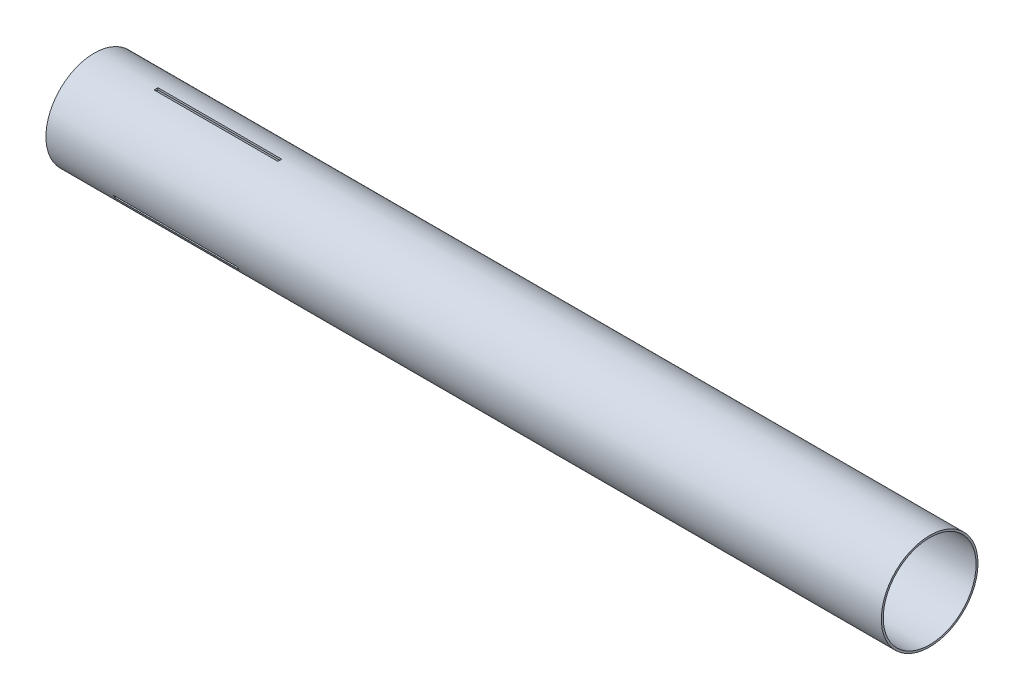
ISO-10303-21;
HEADER;
FILE_DESCRIPTION(('STEP AP214'),'2;1');
FILE_NAME('part.step','',(''),(''),'','','');
FILE_SCHEMA(('AUTOMOTIVE_DESIGN { 1 0 10303 214 1 1 1 1 }'));
ENDSEC;
DATA;
#1=APPLICATION_CONTEXT('core data for automotive mechanical design processes');
#2=APPLICATION_PROTOCOL_DEFINITION('international standard','automotive_design',2000,#1);
#3=PRODUCT_CONTEXT('',#1,'mechanical');
#4=PRODUCT('Part','Part','',(#3));
#5=PRODUCT_RELATED_PRODUCT_CATEGORY('part','',(#4));
#6=PRODUCT_DEFINITION_FORMATION('','',#4);
#7=PRODUCT_DEFINITION_CONTEXT('part definition',#1,'design');
#8=PRODUCT_DEFINITION('design','',#6,#7);
#9=PRODUCT_DEFINITION_SHAPE('','',#8);
#10=(LENGTH_UNIT() NAMED_UNIT(*) SI_UNIT(.MILLI.,.METRE.));
#11=(NAMED_UNIT(*) PLANE_ANGLE_UNIT() SI_UNIT($,.RADIAN.));
#12=(NAMED_UNIT(*) SI_UNIT($,.STERADIAN.) SOLID_ANGLE_UNIT());
#13=UNCERTAINTY_MEASURE_WITH_UNIT(LENGTH_MEASURE(1.E-05),#10,'distance_accuracy_value','');
#14=(GEOMETRIC_REPRESENTATION_CONTEXT(3) GLOBAL_UNCERTAINTY_ASSIGNED_CONTEXT((#13)) GLOBAL_UNIT_ASSIGNED_CONTEXT((#10,
#11,#12)) REPRESENTATION_CONTEXT('',''));
#15=CARTESIAN_POINT('',(0.,0.,0.));
#16=DIRECTION('',(0.,0.,1.));
#17=DIRECTION('',(1.,0.,0.));
#18=AXIS2_PLACEMENT_3D('',#15,#16,#17);
#19=CARTESIAN_POINT('',(685.8,0.,0.));
#20=DIRECTION('',(-1.,0.,0.));
#21=DIRECTION('',(0.,0.,1.));
#22=AXIS2_PLACEMENT_3D('',#19,#20,#21);
#23=CYLINDRICAL_SURFACE('',#22,39.6748);
#24=CARTESIAN_POINT('',(152.4,0.,0.));
#25=DIRECTION('',(-1.,0.,0.));
#26=DIRECTION('',(0.,0.,1.));
#27=AXIS2_PLACEMENT_3D('',#24,#25,#26);
#28=CIRCLE('',#27,39.6748);
#29=CARTESIAN_POINT('',(152.4,-21.1963288856885,33.5381185639524));
#30=VERTEX_POINT('',#29);
#31=CARTESIAN_POINT('',(152.4,-18.4466982286729,35.1256185639524));
#32=VERTEX_POINT('',#31);
#33=EDGE_CURVE('E170',#30,#32,#28,.T.);
#34=ORIENTED_EDGE('',*,*,#33,.F.);
#35=DIRECTION('',(-1.,0.,0.));
#36=VECTOR('',#35,1.);
#37=CARTESIAN_POINT('',(152.4,-21.1963288856885,33.5381185639524));
#38=LINE('',#37,#36);
#39=CARTESIAN_POINT('',(50.8,-21.1963288856885,33.5381185639524));
#40=VERTEX_POINT('',#39);
#41=EDGE_CURVE('E162',#30,#40,#38,.T.);
#42=ORIENTED_EDGE('',*,*,#41,.T.);
#43=CARTESIAN_POINT('',(50.8,0.,0.));
#44=DIRECTION('',(-1.,0.,0.));
#45=DIRECTION('',(0.,0.,1.));
#46=AXIS2_PLACEMENT_3D('',#43,#44,#45);
#47=CIRCLE('',#46,39.6748);
#48=CARTESIAN_POINT('',(50.8,-18.4466982286729,35.1256185639524));
#49=VERTEX_POINT('',#48);
#50=EDGE_CURVE('E174',#40,#49,#47,.T.);
#51=ORIENTED_EDGE('',*,*,#50,.T.);
#52=DIRECTION('',(-1.,0.,0.));
#53=VECTOR('',#52,1.);
#54=CARTESIAN_POINT('',(152.4,-18.4466982286729,35.1256185639524));
#55=LINE('',#54,#53);
#56=EDGE_CURVE('E153',#32,#49,#55,.T.);
#57=ORIENTED_EDGE('',*,*,#56,.F.);
#58=EDGE_LOOP('',(#34,#42,#51,#57));
#59=FACE_BOUND('',#58,.T.);
#60=CARTESIAN_POINT('',(0.,0.,0.));
#61=DIRECTION('',(1.,0.,0.));
#62=DIRECTION('',(0.,0.,-1.));
#63=AXIS2_PLACEMENT_3D('',#60,#61,#62);
#64=CIRCLE('',#63,39.6748);
#65=CARTESIAN_POINT('',(0.,0.,-39.6748));
#66=VERTEX_POINT('',#65);
#67=EDGE_CURVE('E40',#66,#66,#64,.T.);
#68=ORIENTED_EDGE('',*,*,#67,.T.);
#69=EDGE_LOOP('',(#68));
#70=FACE_BOUND('',#69,.T.);
#71=CARTESIAN_POINT('',(685.8,0.,0.));
#72=DIRECTION('',(1.,0.,0.));
#73=DIRECTION('',(0.,0.,-1.));
#74=AXIS2_PLACEMENT_3D('',#71,#72,#73);
#75=CIRCLE('',#74,39.6748);
#76=CARTESIAN_POINT('',(685.8,0.,-39.6748));
#77=VERTEX_POINT('',#76);
#78=EDGE_CURVE('E11',#77,#77,#75,.T.);
#79=ORIENTED_EDGE('',*,*,#78,.F.);
#80=EDGE_LOOP('',(#79));
#81=FACE_BOUND('',#80,.T.);
#82=CARTESIAN_POINT('',(152.4,0.,0.));
#83=DIRECTION('',(-1.,0.,0.));
#84=DIRECTION('',(0.,0.,1.));
#85=AXIS2_PLACEMENT_3D('',#82,#83,#84);
#86=CIRCLE('',#85,39.6748);
#87=CARTESIAN_POINT('',(152.4,-18.446698228673,-35.1256185639524));
#88=VERTEX_POINT('',#87);
#89=CARTESIAN_POINT('',(152.4,-21.1963288856886,-33.5381185639524));
#90=VERTEX_POINT('',#89);
#91=EDGE_CURVE('E203',#88,#90,#86,.T.);
#92=ORIENTED_EDGE('',*,*,#91,.F.);
#93=DIRECTION('',(-1.,0.,0.));
#94=VECTOR('',#93,1.);
#95=CARTESIAN_POINT('',(152.4,-18.446698228673,-35.1256185639524));
#96=LINE('',#95,#94);
#97=CARTESIAN_POINT('',(50.8,-18.446698228673,-35.1256185639524));
#98=VERTEX_POINT('',#97);
#99=EDGE_CURVE('E196',#88,#98,#96,.T.);
#100=ORIENTED_EDGE('',*,*,#99,.T.);
#101=CARTESIAN_POINT('',(50.8,0.,0.));
#102=DIRECTION('',(-1.,0.,0.));
#103=DIRECTION('',(0.,0.,1.));
#104=AXIS2_PLACEMENT_3D('',#101,#102,#103);
#105=CIRCLE('',#104,39.6748);
#106=CARTESIAN_POINT('',(50.8,-21.1963288856886,-33.5381185639524));
#107=VERTEX_POINT('',#106);
#108=EDGE_CURVE('E165',#98,#107,#105,.T.);
#109=ORIENTED_EDGE('',*,*,#108,.T.);
#110=DIRECTION('',(-1.,0.,0.));
#111=VECTOR('',#110,1.);
#112=CARTESIAN_POINT('',(152.4,-21.1963288856886,-33.5381185639524));
#113=LINE('',#112,#111);
#114=EDGE_CURVE('E186',#90,#107,#113,.T.);
#115=ORIENTED_EDGE('',*,*,#114,.F.);
#116=EDGE_LOOP('',(#92,#100,#109,#115));
#117=FACE_BOUND('',#116,.T.);
#118=CARTESIAN_POINT('',(152.4,0.,0.));
#119=DIRECTION('',(-1.,0.,0.));
#120=DIRECTION('',(0.,0.,1.));
#121=AXIS2_PLACEMENT_3D('',#118,#119,#120);
#122=CIRCLE('',#121,39.6748);
#123=CARTESIAN_POINT('',(152.4,39.6430271143615,1.5875));
#124=VERTEX_POINT('',#123);
#125=CARTESIAN_POINT('',(152.4,39.6430271143615,-1.5875));
#126=VERTEX_POINT('',#125);
#127=EDGE_CURVE('E135',#124,#126,#122,.T.);
#128=ORIENTED_EDGE('',*,*,#127,.F.);
#129=DIRECTION('',(-1.,0.,0.));
#130=VECTOR('',#129,1.);
#131=CARTESIAN_POINT('',(152.4,39.6430271143615,1.5875));
#132=LINE('',#131,#130);
#133=CARTESIAN_POINT('',(50.8,39.6430271143615,1.5875));
#134=VERTEX_POINT('',#133);
#135=EDGE_CURVE('E225',#124,#134,#132,.T.);
#136=ORIENTED_EDGE('',*,*,#135,.T.);
#137=CARTESIAN_POINT('',(50.8,0.,0.));
#138=DIRECTION('',(-1.,0.,0.));
#139=DIRECTION('',(0.,0.,1.));
#140=AXIS2_PLACEMENT_3D('',#137,#138,#139);
#141=CIRCLE('',#140,39.6748);
#142=CARTESIAN_POINT('',(50.8,39.6430271143615,-1.5875));
#143=VERTEX_POINT('',#142);
#144=EDGE_CURVE('E146',#134,#143,#141,.T.);
#145=ORIENTED_EDGE('',*,*,#144,.T.);
#146=DIRECTION('',(-1.,0.,0.));
#147=VECTOR('',#146,1.);
#148=CARTESIAN_POINT('',(152.4,39.6430271143615,-1.5875));
#149=LINE('',#148,#147);
#150=EDGE_CURVE('E128',#126,#143,#149,.T.);
#151=ORIENTED_EDGE('',*,*,#150,.F.);
#152=EDGE_LOOP('',(#128,#136,#145,#151));
#153=FACE_BOUND('',#152,.T.);
#154=ADVANCED_FACE('F37',(#59,#70,#81,#117,#153),#23,.T.);
#155=CARTESIAN_POINT('',(685.8,0.,0.));
#156=DIRECTION('',(-1.,0.,0.));
#157=DIRECTION('',(0.,0.,1.));
#158=AXIS2_PLACEMENT_3D('',#155,#156,#157);
#159=CYLINDRICAL_SURFACE('',#158,38.1);
#160=CARTESIAN_POINT('',(685.8,0.,0.));
#161=DIRECTION('',(1.,0.,0.));
#162=DIRECTION('',(0.,0.,-1.));
#163=AXIS2_PLACEMENT_3D('',#160,#161,#162);
#164=CIRCLE('',#163,38.1);
#165=CARTESIAN_POINT('',(685.8,0.,-38.1));
#166=VERTEX_POINT('',#165);
#167=EDGE_CURVE('E220',#166,#166,#164,.T.);
#168=ORIENTED_EDGE('',*,*,#167,.T.);
#169=EDGE_LOOP('',(#168));
#170=FACE_BOUND('',#169,.T.);
#171=CARTESIAN_POINT('',(0.,0.,0.));
#172=DIRECTION('',(1.,0.,0.));
#173=DIRECTION('',(0.,0.,-1.));
#174=AXIS2_PLACEMENT_3D('',#171,#172,#173);
#175=CIRCLE('',#174,38.1);
#176=CARTESIAN_POINT('',(0.,0.,-38.1));
#177=VERTEX_POINT('',#176);
#178=EDGE_CURVE('E223',#177,#177,#175,.T.);
#179=ORIENTED_EDGE('',*,*,#178,.F.);
#180=EDGE_LOOP('',(#179));
#181=FACE_BOUND('',#180,.T.);
#182=DIRECTION('',(-1.,0.,0.));
#183=VECTOR('',#182,1.);
#184=CARTESIAN_POINT('',(152.4,-17.6586410296396,-33.7606634559561));
#185=LINE('',#184,#183);
#186=CARTESIAN_POINT('',(152.4,-17.6586410296396,-33.7606634559561));
#187=VERTEX_POINT('',#186);
#188=CARTESIAN_POINT('',(50.8,-17.6586410296396,-33.7606634559561));
#189=VERTEX_POINT('',#188);
#190=EDGE_CURVE('E193',#187,#189,#185,.T.);
#191=ORIENTED_EDGE('',*,*,#190,.F.);
#192=CARTESIAN_POINT('',(152.4,0.,0.));
#193=DIRECTION('',(1.,0.,0.));
#194=DIRECTION('',(0.,0.,1.));
#195=AXIS2_PLACEMENT_3D('',#192,#193,#194);
#196=CIRCLE('',#195,38.1);
#197=CARTESIAN_POINT('',(152.4,-20.4082716866552,-32.1731634559561));
#198=VERTEX_POINT('',#197);
#199=EDGE_CURVE('E213',#198,#187,#196,.T.);
#200=ORIENTED_EDGE('',*,*,#199,.F.);
#201=DIRECTION('',(-1.,0.,0.));
#202=VECTOR('',#201,1.);
#203=CARTESIAN_POINT('',(152.4,-20.4082716866552,-32.1731634559561));
#204=LINE('',#203,#202);
#205=CARTESIAN_POINT('',(50.8,-20.4082716866552,-32.1731634559561));
#206=VERTEX_POINT('',#205);
#207=EDGE_CURVE('E190',#198,#206,#204,.T.);
#208=ORIENTED_EDGE('',*,*,#207,.T.);
#209=CARTESIAN_POINT('',(50.8,0.,0.));
#210=DIRECTION('',(1.,0.,0.));
#211=DIRECTION('',(0.,0.,1.));
#212=AXIS2_PLACEMENT_3D('',#209,#210,#211);
#213=CIRCLE('',#212,38.1);
#214=EDGE_CURVE('E202',#206,#189,#213,.T.);
#215=ORIENTED_EDGE('',*,*,#214,.T.);
#216=EDGE_LOOP('',(#191,#200,#208,#215));
#217=FACE_BOUND('',#216,.T.);
#218=DIRECTION('',(-1.,0.,0.));
#219=VECTOR('',#218,1.);
#220=CARTESIAN_POINT('',(152.4,-20.4082716866551,32.1731634559561));
#221=LINE('',#220,#219);
#222=CARTESIAN_POINT('',(152.4,-20.4082716866551,32.1731634559561));
#223=VERTEX_POINT('',#222);
#224=CARTESIAN_POINT('',(50.8,-20.4082716866551,32.1731634559561));
#225=VERTEX_POINT('',#224);
#226=EDGE_CURVE('E159',#223,#225,#221,.T.);
#227=ORIENTED_EDGE('',*,*,#226,.F.);
#228=CARTESIAN_POINT('',(152.4,0.,0.));
#229=DIRECTION('',(1.,0.,0.));
#230=DIRECTION('',(0.,0.,1.));
#231=AXIS2_PLACEMENT_3D('',#228,#229,#230);
#232=CIRCLE('',#231,38.1);
#233=CARTESIAN_POINT('',(152.4,-17.6586410296396,33.7606634559561));
#234=VERTEX_POINT('',#233);
#235=EDGE_CURVE('E179',#234,#223,#232,.T.);
#236=ORIENTED_EDGE('',*,*,#235,.F.);
#237=DIRECTION('',(-1.,0.,0.));
#238=VECTOR('',#237,1.);
#239=CARTESIAN_POINT('',(152.4,-17.6586410296396,33.7606634559561));
#240=LINE('',#239,#238);
#241=CARTESIAN_POINT('',(50.8,-17.6586410296396,33.7606634559561));
#242=VERTEX_POINT('',#241);
#243=EDGE_CURVE('E156',#234,#242,#240,.T.);
#244=ORIENTED_EDGE('',*,*,#243,.T.);
#245=CARTESIAN_POINT('',(50.8,0.,0.));
#246=DIRECTION('',(1.,0.,0.));
#247=DIRECTION('',(0.,0.,1.));
#248=AXIS2_PLACEMENT_3D('',#245,#246,#247);
#249=CIRCLE('',#248,38.1);
#250=EDGE_CURVE('E169',#242,#225,#249,.T.);
#251=ORIENTED_EDGE('',*,*,#250,.T.);
#252=EDGE_LOOP('',(#227,#236,#244,#251));
#253=FACE_BOUND('',#252,.T.);
#254=DIRECTION('',(-1.,0.,0.));
#255=VECTOR('',#254,1.);
#256=CARTESIAN_POINT('',(152.4,38.0669127162947,1.5875));
#257=LINE('',#256,#255);
#258=CARTESIAN_POINT('',(152.4,38.0669127162947,1.5875));
#259=VERTEX_POINT('',#258);
#260=CARTESIAN_POINT('',(50.8,38.0669127162947,1.5875));
#261=VERTEX_POINT('',#260);
#262=EDGE_CURVE('E148',#259,#261,#257,.T.);
#263=ORIENTED_EDGE('',*,*,#262,.F.);
#264=CARTESIAN_POINT('',(152.4,0.,0.));
#265=DIRECTION('',(1.,0.,0.));
#266=DIRECTION('',(0.,0.,1.));
#267=AXIS2_PLACEMENT_3D('',#264,#265,#266);
#268=CIRCLE('',#267,38.1);
#269=CARTESIAN_POINT('',(152.4,38.0669127162947,-1.5875));
#270=VERTEX_POINT('',#269);
#271=EDGE_CURVE('E134',#270,#259,#268,.T.);
#272=ORIENTED_EDGE('',*,*,#271,.F.);
#273=DIRECTION('',(-1.,0.,0.));
#274=VECTOR('',#273,1.);
#275=CARTESIAN_POINT('',(152.4,38.0669127162947,-1.5875));
#276=LINE('',#275,#274);
#277=CARTESIAN_POINT('',(50.8,38.0669127162947,-1.5875));
#278=VERTEX_POINT('',#277);
#279=EDGE_CURVE('E131',#270,#278,#276,.T.);
#280=ORIENTED_EDGE('',*,*,#279,.T.);
#281=CARTESIAN_POINT('',(50.8,0.,0.));
#282=DIRECTION('',(1.,0.,0.));
#283=DIRECTION('',(0.,0.,1.));
#284=AXIS2_PLACEMENT_3D('',#281,#282,#283);
#285=CIRCLE('',#284,38.1);
#286=EDGE_CURVE('E233',#278,#261,#285,.T.);
#287=ORIENTED_EDGE('',*,*,#286,.T.);
#288=EDGE_LOOP('',(#263,#272,#280,#287));
#289=FACE_BOUND('',#288,.T.);
#290=ADVANCED_FACE('F242',(#170,#181,#217,#253,#289),#159,.F.);
#291=CARTESIAN_POINT('',(685.8,0.,0.));
#292=DIRECTION('',(1.,0.,0.));
#293=DIRECTION('',(0.,0.,-1.));
#294=AXIS2_PLACEMENT_3D('',#291,#292,#293);
#295=PLANE('',#294);
#296=ORIENTED_EDGE('',*,*,#78,.T.);
#297=EDGE_LOOP('',(#296));
#298=FACE_BOUND('',#297,.T.);
#299=ORIENTED_EDGE('',*,*,#167,.F.);
#300=EDGE_LOOP('',(#299));
#301=FACE_BOUND('',#300,.T.);
#302=ADVANCED_FACE('F256',(#298,#301),#295,.T.);
#303=CARTESIAN_POINT('',(0.,0.,0.));
#304=DIRECTION('',(1.,0.,0.));
#305=DIRECTION('',(0.,0.,-1.));
#306=AXIS2_PLACEMENT_3D('',#303,#304,#305);
#307=PLANE('',#306);
#308=ORIENTED_EDGE('',*,*,#67,.F.);
#309=EDGE_LOOP('',(#308));
#310=FACE_BOUND('',#309,.T.);
#311=ORIENTED_EDGE('',*,*,#178,.T.);
#312=EDGE_LOOP('',(#311));
#313=FACE_BOUND('',#312,.T.);
#314=ADVANCED_FACE('F289',(#310,#313),#307,.F.);
#315=CARTESIAN_POINT('',(152.4,-18.446698228673,-35.1256185639524));
#316=DIRECTION('',(0.,0.866025403784438,-0.500000000000001));
#317=DIRECTION('',(0.,0.500000000000001,0.866025403784438));
#318=AXIS2_PLACEMENT_3D('',#315,#316,#317);
#319=PLANE('',#318);
#320=DIRECTION('',(0.,-0.500000000000001,-0.866025403784438));
#321=VECTOR('',#320,1.);
#322=CARTESIAN_POINT('',(50.8,-18.446698228673,-35.1256185639524));
#323=LINE('',#322,#321);
#324=EDGE_CURVE('E199',#189,#98,#323,.T.);
#325=ORIENTED_EDGE('',*,*,#324,.T.);
#326=ORIENTED_EDGE('',*,*,#99,.F.);
#327=DIRECTION('',(0.,-0.500000000000001,-0.866025403784438));
#328=VECTOR('',#327,1.);
#329=CARTESIAN_POINT('',(152.4,-18.446698228673,-35.1256185639524));
#330=LINE('',#329,#328);
#331=EDGE_CURVE('E189',#187,#88,#330,.T.);
#332=ORIENTED_EDGE('',*,*,#331,.F.);
#333=ORIENTED_EDGE('',*,*,#190,.T.);
#334=EDGE_LOOP('',(#325,#326,#332,#333));
#335=FACE_BOUND('',#334,.T.);
#336=ADVANCED_FACE('F275',(#335),#319,.F.);
#337=CARTESIAN_POINT('',(152.4,-21.1963288856886,-33.5381185639524));
#338=DIRECTION('',(0.,-0.866025403784438,0.500000000000001));
#339=DIRECTION('',(0.,-0.500000000000001,-0.866025403784438));
#340=AXIS2_PLACEMENT_3D('',#337,#338,#339);
#341=PLANE('',#340);
#342=DIRECTION('',(0.,0.500000000000001,0.866025403784438));
#343=VECTOR('',#342,1.);
#344=CARTESIAN_POINT('',(50.8,-21.1963288856886,-33.5381185639524));
#345=LINE('',#344,#343);
#346=EDGE_CURVE('E206',#107,#206,#345,.T.);
#347=ORIENTED_EDGE('',*,*,#346,.T.);
#348=ORIENTED_EDGE('',*,*,#207,.F.);
#349=DIRECTION('',(0.,0.500000000000001,0.866025403784438));
#350=VECTOR('',#349,1.);
#351=CARTESIAN_POINT('',(152.4,-21.1963288856886,-33.5381185639524));
#352=LINE('',#351,#350);
#353=EDGE_CURVE('E215',#90,#198,#352,.T.);
#354=ORIENTED_EDGE('',*,*,#353,.F.);
#355=ORIENTED_EDGE('',*,*,#114,.T.);
#356=EDGE_LOOP('',(#347,#348,#354,#355));
#357=FACE_BOUND('',#356,.T.);
#358=ADVANCED_FACE('F281',(#357),#341,.F.);
#359=CARTESIAN_POINT('',(152.4,0.,0.));
#360=DIRECTION('',(-1.,0.,0.));
#361=DIRECTION('',(0.,0.,1.));
#362=AXIS2_PLACEMENT_3D('',#359,#360,#361);
#363=PLANE('',#362);
#364=ORIENTED_EDGE('',*,*,#91,.T.);
#365=ORIENTED_EDGE('',*,*,#353,.T.);
#366=ORIENTED_EDGE('',*,*,#199,.T.);
#367=ORIENTED_EDGE('',*,*,#331,.T.);
#368=EDGE_LOOP('',(#364,#365,#366,#367));
#369=FACE_BOUND('',#368,.T.);
#370=ADVANCED_FACE('F270',(#369),#363,.T.);
#371=CARTESIAN_POINT('',(50.8,0.,0.));
#372=DIRECTION('',(-1.,0.,0.));
#373=DIRECTION('',(0.,0.,1.));
#374=AXIS2_PLACEMENT_3D('',#371,#372,#373);
#375=PLANE('',#374);
#376=ORIENTED_EDGE('',*,*,#108,.F.);
#377=ORIENTED_EDGE('',*,*,#324,.F.);
#378=ORIENTED_EDGE('',*,*,#214,.F.);
#379=ORIENTED_EDGE('',*,*,#346,.F.);
#380=EDGE_LOOP('',(#376,#377,#378,#379));
#381=FACE_BOUND('',#380,.T.);
#382=ADVANCED_FACE('F279',(#381),#375,.F.);
#383=CARTESIAN_POINT('',(152.4,-21.1963288856885,33.5381185639524));
#384=DIRECTION('',(0.,-0.866025403784439,-0.499999999999999));
#385=DIRECTION('',(0.,0.499999999999999,-0.866025403784439));
#386=AXIS2_PLACEMENT_3D('',#383,#384,#385);
#387=PLANE('',#386);
#388=DIRECTION('',(0.,-0.499999999999999,0.866025403784439));
#389=VECTOR('',#388,1.);
#390=CARTESIAN_POINT('',(50.8,-21.1963288856885,33.5381185639524));
#391=LINE('',#390,#389);
#392=EDGE_CURVE('E166',#225,#40,#391,.T.);
#393=ORIENTED_EDGE('',*,*,#392,.T.);
#394=ORIENTED_EDGE('',*,*,#41,.F.);
#395=DIRECTION('',(0.,-0.499999999999999,0.866025403784439));
#396=VECTOR('',#395,1.);
#397=CARTESIAN_POINT('',(152.4,-21.1963288856885,33.5381185639524));
#398=LINE('',#397,#396);
#399=EDGE_CURVE('E155',#223,#30,#398,.T.);
#400=ORIENTED_EDGE('',*,*,#399,.F.);
#401=ORIENTED_EDGE('',*,*,#226,.T.);
#402=EDGE_LOOP('',(#393,#394,#400,#401));
#403=FACE_BOUND('',#402,.T.);
#404=ADVANCED_FACE('F296',(#403),#387,.F.);
#405=CARTESIAN_POINT('',(152.4,-18.4466982286729,35.1256185639524));
#406=DIRECTION('',(0.,0.866025403784439,0.499999999999999));
#407=DIRECTION('',(0.,-0.499999999999999,0.866025403784439));
#408=AXIS2_PLACEMENT_3D('',#405,#406,#407);
#409=PLANE('',#408);
#410=DIRECTION('',(0.,0.499999999999999,-0.866025403784439));
#411=VECTOR('',#410,1.);
#412=CARTESIAN_POINT('',(50.8,-18.4466982286729,35.1256185639524));
#413=LINE('',#412,#411);
#414=EDGE_CURVE('E59',#49,#242,#413,.T.);
#415=ORIENTED_EDGE('',*,*,#414,.T.);
#416=ORIENTED_EDGE('',*,*,#243,.F.);
#417=DIRECTION('',(0.,0.499999999999999,-0.866025403784439));
#418=VECTOR('',#417,1.);
#419=CARTESIAN_POINT('',(152.4,-18.4466982286729,35.1256185639524));
#420=LINE('',#419,#418);
#421=EDGE_CURVE('E181',#32,#234,#420,.T.);
#422=ORIENTED_EDGE('',*,*,#421,.F.);
#423=ORIENTED_EDGE('',*,*,#56,.T.);
#424=EDGE_LOOP('',(#415,#416,#422,#423));
#425=FACE_BOUND('',#424,.T.);
#426=ADVANCED_FACE('F343',(#425),#409,.F.);
#427=CARTESIAN_POINT('',(152.4,0.,0.));
#428=DIRECTION('',(-1.,0.,0.));
#429=DIRECTION('',(0.,0.,1.));
#430=AXIS2_PLACEMENT_3D('',#427,#428,#429);
#431=PLANE('',#430);
#432=ORIENTED_EDGE('',*,*,#33,.T.);
#433=ORIENTED_EDGE('',*,*,#421,.T.);
#434=ORIENTED_EDGE('',*,*,#235,.T.);
#435=ORIENTED_EDGE('',*,*,#399,.T.);
#436=EDGE_LOOP('',(#432,#433,#434,#435));
#437=FACE_BOUND('',#436,.T.);
#438=ADVANCED_FACE('F292',(#437),#431,.T.);
#439=CARTESIAN_POINT('',(50.8,0.,0.));
#440=DIRECTION('',(-1.,0.,0.));
#441=DIRECTION('',(0.,0.,1.));
#442=AXIS2_PLACEMENT_3D('',#439,#440,#441);
#443=PLANE('',#442);
#444=ORIENTED_EDGE('',*,*,#50,.F.);
#445=ORIENTED_EDGE('',*,*,#392,.F.);
#446=ORIENTED_EDGE('',*,*,#250,.F.);
#447=ORIENTED_EDGE('',*,*,#414,.F.);
#448=EDGE_LOOP('',(#444,#445,#446,#447));
#449=FACE_BOUND('',#448,.T.);
#450=ADVANCED_FACE('F364',(#449),#443,.F.);
#451=CARTESIAN_POINT('',(152.4,39.6430271143615,1.5875));
#452=DIRECTION('',(0.,0.,1.));
#453=DIRECTION('',(0.,-1.,0.));
#454=AXIS2_PLACEMENT_3D('',#451,#452,#453);
#455=PLANE('',#454);
#456=DIRECTION('',(0.,1.,0.));
#457=VECTOR('',#456,1.);
#458=CARTESIAN_POINT('',(50.8,39.6430271143615,1.5875));
#459=LINE('',#458,#457);
#460=EDGE_CURVE('E144',#261,#134,#459,.T.);
#461=ORIENTED_EDGE('',*,*,#460,.T.);
#462=ORIENTED_EDGE('',*,*,#135,.F.);
#463=DIRECTION('',(0.,1.,0.));
#464=VECTOR('',#463,1.);
#465=CARTESIAN_POINT('',(152.4,39.6430271143615,1.5875));
#466=LINE('',#465,#464);
#467=EDGE_CURVE('E141',#259,#124,#466,.T.);
#468=ORIENTED_EDGE('',*,*,#467,.F.);
#469=ORIENTED_EDGE('',*,*,#262,.T.);
#470=EDGE_LOOP('',(#461,#462,#468,#469));
#471=FACE_BOUND('',#470,.T.);
#472=ADVANCED_FACE('F241',(#471),#455,.F.);
#473=CARTESIAN_POINT('',(152.4,39.6430271143615,-1.5875));
#474=DIRECTION('',(0.,0.,-1.));
#475=DIRECTION('',(0.,1.,0.));
#476=AXIS2_PLACEMENT_3D('',#473,#474,#475);
#477=PLANE('',#476);
#478=DIRECTION('',(0.,-1.,0.));
#479=VECTOR('',#478,1.);
#480=CARTESIAN_POINT('',(50.8,39.6430271143615,-1.5875));
#481=LINE('',#480,#479);
#482=EDGE_CURVE('E51',#143,#278,#481,.T.);
#483=ORIENTED_EDGE('',*,*,#482,.T.);
#484=ORIENTED_EDGE('',*,*,#279,.F.);
#485=DIRECTION('',(0.,-1.,0.));
#486=VECTOR('',#485,1.);
#487=CARTESIAN_POINT('',(152.4,39.6430271143615,-1.5875));
#488=LINE('',#487,#486);
#489=EDGE_CURVE('E124',#126,#270,#488,.T.);
#490=ORIENTED_EDGE('',*,*,#489,.F.);
#491=ORIENTED_EDGE('',*,*,#150,.T.);
#492=EDGE_LOOP('',(#483,#484,#490,#491));
#493=FACE_BOUND('',#492,.T.);
#494=ADVANCED_FACE('F126',(#493),#477,.F.);
#495=CARTESIAN_POINT('',(152.4,0.,0.));
#496=DIRECTION('',(-1.,0.,0.));
#497=DIRECTION('',(0.,0.,1.));
#498=AXIS2_PLACEMENT_3D('',#495,#496,#497);
#499=PLANE('',#498);
#500=ORIENTED_EDGE('',*,*,#127,.T.);
#501=ORIENTED_EDGE('',*,*,#489,.T.);
#502=ORIENTED_EDGE('',*,*,#271,.T.);
#503=ORIENTED_EDGE('',*,*,#467,.T.);
#504=EDGE_LOOP('',(#500,#501,#502,#503));
#505=FACE_BOUND('',#504,.T.);
#506=ADVANCED_FACE('F139',(#505),#499,.T.);
#507=CARTESIAN_POINT('',(50.8,0.,0.));
#508=DIRECTION('',(-1.,0.,0.));
#509=DIRECTION('',(0.,0.,1.));
#510=AXIS2_PLACEMENT_3D('',#507,#508,#509);
#511=PLANE('',#510);
#512=ORIENTED_EDGE('',*,*,#144,.F.);
#513=ORIENTED_EDGE('',*,*,#460,.F.);
#514=ORIENTED_EDGE('',*,*,#286,.F.);
#515=ORIENTED_EDGE('',*,*,#482,.F.);
#516=EDGE_LOOP('',(#512,#513,#514,#515));
#517=FACE_BOUND('',#516,.T.);
#518=ADVANCED_FACE('F243',(#517),#511,.F.);
#519=CLOSED_SHELL('',(#154,#290,#302,#314,#336,#358,#370,#382,#404,#426,#438,#450,#472,#494,
#506,#518));
#520=MANIFOLD_SOLID_BREP('B2',#519);
#521=ADVANCED_BREP_SHAPE_REPRESENTATION('',(#18,#520),#14);
#522=SHAPE_DEFINITION_REPRESENTATION(#9,#521);
ENDSEC;
END-ISO-10303-21;
